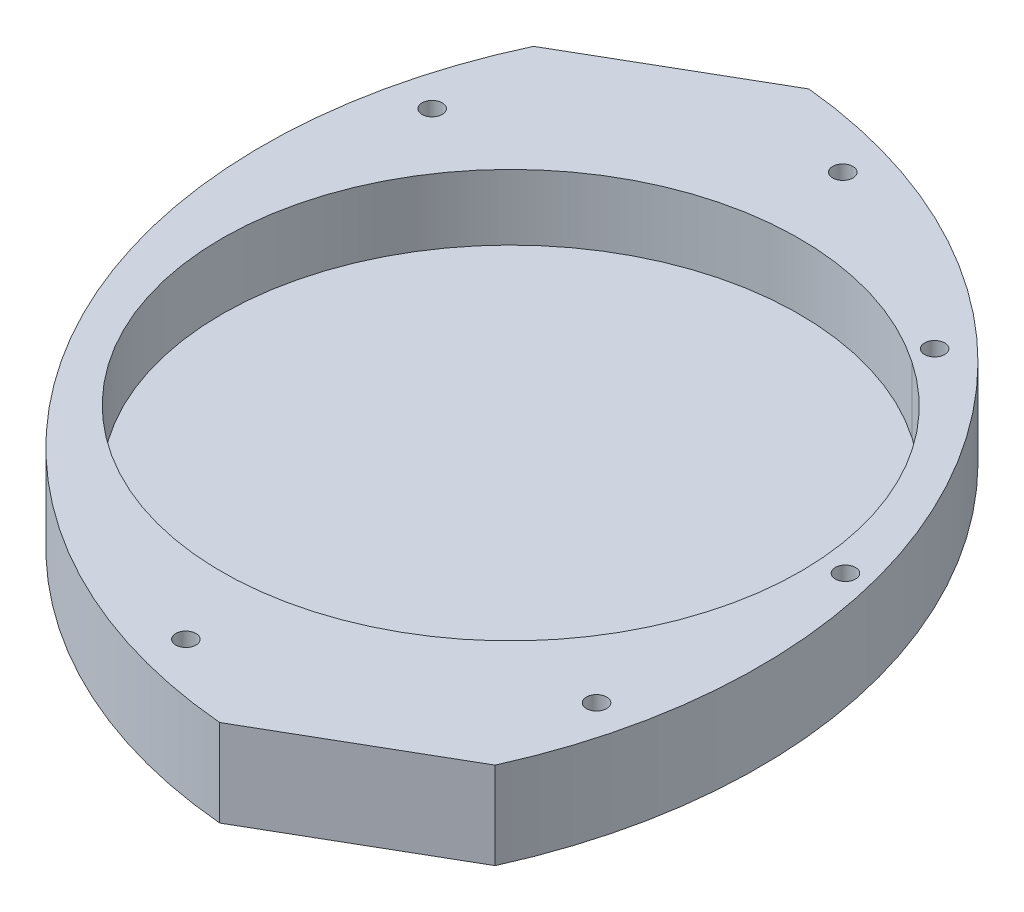
ISO-10303-21;
HEADER;
FILE_DESCRIPTION(('STEP AP214'),'2;1');
FILE_NAME('part.step','',(''),(''),'','','');
FILE_SCHEMA(('AUTOMOTIVE_DESIGN { 1 0 10303 214 1 1 1 1 }'));
ENDSEC;
DATA;
#1=APPLICATION_CONTEXT('core data for automotive mechanical design processes');
#2=APPLICATION_PROTOCOL_DEFINITION('international standard','automotive_design',2000,#1);
#3=PRODUCT_CONTEXT('',#1,'mechanical');
#4=PRODUCT('Part','Part','',(#3));
#5=PRODUCT_RELATED_PRODUCT_CATEGORY('part','',(#4));
#6=PRODUCT_DEFINITION_FORMATION('','',#4);
#7=PRODUCT_DEFINITION_CONTEXT('part definition',#1,'design');
#8=PRODUCT_DEFINITION('design','',#6,#7);
#9=PRODUCT_DEFINITION_SHAPE('','',#8);
#10=(LENGTH_UNIT() NAMED_UNIT(*) SI_UNIT(.MILLI.,.METRE.));
#11=(NAMED_UNIT(*) PLANE_ANGLE_UNIT() SI_UNIT($,.RADIAN.));
#12=(NAMED_UNIT(*) SI_UNIT($,.STERADIAN.) SOLID_ANGLE_UNIT());
#13=UNCERTAINTY_MEASURE_WITH_UNIT(LENGTH_MEASURE(1.E-05),#10,'distance_accuracy_value','');
#14=(GEOMETRIC_REPRESENTATION_CONTEXT(3) GLOBAL_UNCERTAINTY_ASSIGNED_CONTEXT((#13)) GLOBAL_UNIT_ASSIGNED_CONTEXT((#10,
#11,#12)) REPRESENTATION_CONTEXT('',''));
#15=CARTESIAN_POINT('',(0.,0.,0.));
#16=DIRECTION('',(0.,0.,1.));
#17=DIRECTION('',(1.,0.,0.));
#18=AXIS2_PLACEMENT_3D('',#15,#16,#17);
#19=CARTESIAN_POINT('',(213.514068784068,-90.805,-300.226275152134));
#20=DIRECTION('',(0.,1.,0.));
#21=DIRECTION('',(0.,0.,1.));
#22=AXIS2_PLACEMENT_3D('',#19,#20,#21);
#23=PLANE('',#22);
#24=CARTESIAN_POINT('',(-0.739793922050286,-90.805,0.263949779186919));
#25=DIRECTION('',(0.,1.,0.));
#26=DIRECTION('',(0.,0.,1.));
#27=AXIS2_PLACEMENT_3D('',#24,#25,#26);
#28=CIRCLE('',#27,80.01);
#29=CARTESIAN_POINT('',(44.5474079325533,-90.805,-65.6956548904925));
#30=VERTEX_POINT('',#29);
#31=CARTESIAN_POINT('',(76.0717263329417,-90.805,22.6601649977671));
#32=VERTEX_POINT('',#31);
#33=EDGE_CURVE('E104',#30,#32,#28,.T.);
#34=ORIENTED_EDGE('',*,*,#33,.F.);
#35=CARTESIAN_POINT('',(0.,-90.805,0.));
#36=DIRECTION('',(0.,1.,0.));
#37=DIRECTION('',(0.,0.,1.));
#38=AXIS2_PLACEMENT_3D('',#35,#36,#37);
#39=CIRCLE('',#38,79.375);
#40=EDGE_CURVE('E49',#32,#30,#39,.T.);
#41=ORIENTED_EDGE('',*,*,#40,.F.);
#42=EDGE_LOOP('',(#34,#41));
#43=FACE_BOUND('',#42,.T.);
#44=CARTESIAN_POINT('',(-82.7515968236829,-90.805,-60.0301730109568));
#45=DIRECTION('',(0.,1.,0.));
#46=DIRECTION('',(0.,0.,1.));
#47=AXIS2_PLACEMENT_3D('',#44,#45,#46);
#48=CIRCLE('',#47,2.79999999999999);
#49=CARTESIAN_POINT('',(-82.7515968236829,-90.805,-57.2301730109568));
#50=VERTEX_POINT('',#49);
#51=EDGE_CURVE('E127',#50,#50,#48,.T.);
#52=ORIENTED_EDGE('',*,*,#51,.F.);
#53=EDGE_LOOP('',(#52));
#54=FACE_BOUND('',#53,.T.);
#55=CARTESIAN_POINT('',(86.0110313328311,-90.805,-5.7939028008508));
#56=DIRECTION('',(0.,1.,0.));
#57=DIRECTION('',(0.,0.,1.));
#58=AXIS2_PLACEMENT_3D('',#55,#56,#57);
#59=CIRCLE('',#58,2.79400000000001);
#60=CARTESIAN_POINT('',(86.0110313328311,-90.805,-2.99990280085079));
#61=VERTEX_POINT('',#60);
#62=EDGE_CURVE('E116',#61,#61,#59,.T.);
#63=ORIENTED_EDGE('',*,*,#62,.F.);
#64=EDGE_LOOP('',(#63));
#65=FACE_BOUND('',#64,.T.);
#66=CARTESIAN_POINT('',(-10.6118564092235,-90.805,-101.680071558516));
#67=DIRECTION('',(0.,1.,0.));
#68=DIRECTION('',(0.,0.,1.));
#69=AXIS2_PLACEMENT_3D('',#66,#67,#68);
#70=CIRCLE('',#69,2.8);
#71=CARTESIAN_POINT('',(-10.6118564092235,-90.805,-98.8800715585156));
#72=VERTEX_POINT('',#71);
#73=EDGE_CURVE('E130',#72,#72,#70,.T.);
#74=ORIENTED_EDGE('',*,*,#73,.F.);
#75=EDGE_LOOP('',(#74));
#76=FACE_BOUND('',#75,.T.);
#77=CARTESIAN_POINT('',(82.6102870767567,-90.805,59.7854173496764));
#78=DIRECTION('',(0.,1.,0.));
#79=DIRECTION('',(0.,0.,1.));
#80=AXIS2_PLACEMENT_3D('',#77,#78,#79);
#81=CIRCLE('',#80,2.79999999999999);
#82=CARTESIAN_POINT('',(82.6102870767567,-90.805,62.5854173496764));
#83=VERTEX_POINT('',#82);
#84=EDGE_CURVE('E151',#83,#83,#81,.T.);
#85=ORIENTED_EDGE('',*,*,#84,.F.);
#86=EDGE_LOOP('',(#85));
#87=FACE_BOUND('',#86,.T.);
#88=CARTESIAN_POINT('',(10.4705466622961,-90.805,101.435315897235));
#89=DIRECTION('',(0.,1.,0.));
#90=DIRECTION('',(0.,0.,1.));
#91=AXIS2_PLACEMENT_3D('',#88,#89,#90);
#92=CIRCLE('',#91,2.8);
#93=CARTESIAN_POINT('',(10.4705466622961,-90.805,104.235315897235));
#94=VERTEX_POINT('',#93);
#95=EDGE_CURVE('E134',#94,#94,#92,.T.);
#96=ORIENTED_EDGE('',*,*,#95,.F.);
#97=EDGE_LOOP('',(#96));
#98=FACE_BOUND('',#97,.T.);
#99=CARTESIAN_POINT('',(44.4770863989794,-90.805,-72.035469587526));
#100=DIRECTION('',(0.,1.,0.));
#101=DIRECTION('',(0.,0.,1.));
#102=AXIS2_PLACEMENT_3D('',#99,#100,#101);
#103=CIRCLE('',#102,2.794);
#104=CARTESIAN_POINT('',(44.4770863989794,-90.805,-69.241469587526));
#105=VERTEX_POINT('',#104);
#106=EDGE_CURVE('E141',#105,#105,#103,.T.);
#107=ORIENTED_EDGE('',*,*,#106,.F.);
#108=EDGE_LOOP('',(#107));
#109=FACE_BOUND('',#108,.T.);
#110=DIRECTION('',(-0.866025403784438,0.,0.5));
#111=VECTOR('',#110,1.);
#112=CARTESIAN_POINT('',(62.7619820969,-90.805,-173.563398985594));
#113=LINE('',#112,#111);
#114=CARTESIAN_POINT('',(-35.2703372996776,-90.805,-116.964412992701));
#115=VERTEX_POINT('',#114);
#116=CARTESIAN_POINT('',(-83.6589843405733,-90.805,-89.0272145979133));
#117=VERTEX_POINT('',#116);
#118=EDGE_CURVE('E11',#115,#117,#113,.T.);
#119=ORIENTED_EDGE('',*,*,#118,.T.);
#120=CARTESIAN_POINT('',(47.450398117161,-90.805,-27.5586705669569));
#121=DIRECTION('',(0.,1.,0.));
#122=DIRECTION('',(0.,0.,1.));
#123=AXIS2_PLACEMENT_3D('',#120,#121,#122);
#124=CIRCLE('',#123,144.803494687576);
#125=CARTESIAN_POINT('',(35.129027552749,-90.805,116.719657331412));
#126=VERTEX_POINT('',#125);
#127=EDGE_CURVE('E126',#126,#117,#124,.F.);
#128=ORIENTED_EDGE('',*,*,#127,.F.);
#129=DIRECTION('',(-0.866025403784434,0.,0.500000000000008));
#130=VECTOR('',#129,1.);
#131=CARTESIAN_POINT('',(181.549993990223,-90.805,32.1834729437347));
#132=LINE('',#131,#130);
#133=CARTESIAN_POINT('',(83.5176745936469,-90.805,88.7824589366323));
#134=VERTEX_POINT('',#133);
#135=EDGE_CURVE('E69',#134,#126,#132,.T.);
#136=ORIENTED_EDGE('',*,*,#135,.F.);
#137=CARTESIAN_POINT('',(-49.7044286073696,-90.805,28.5336947955226));
#138=DIRECTION('',(0.,1.,0.));
#139=DIRECTION('',(0.,0.,1.));
#140=AXIS2_PLACEMENT_3D('',#137,#138,#139);
#141=CIRCLE('',#140,146.212319459861);
#142=EDGE_CURVE('E157',#115,#134,#141,.F.);
#143=ORIENTED_EDGE('',*,*,#142,.F.);
#144=EDGE_LOOP('',(#119,#128,#136,#143));
#145=FACE_BOUND('',#144,.T.);
#146=ADVANCED_FACE('F45',(#43,#54,#65,#76,#87,#98,#109,#145),#23,.T.);
#147=CARTESIAN_POINT('',(83.5176745936469,-145.923,88.7824589366323));
#148=DIRECTION('',(-0.500000000000006,0.,-0.866025403784435));
#149=DIRECTION('',(-0.866025403784435,0.,0.500000000000006));
#150=AXIS2_PLACEMENT_3D('',#147,#148,#149);
#151=PLANE('',#150);
#152=DIRECTION('',(0.,1.,0.));
#153=VECTOR('',#152,1.);
#154=CARTESIAN_POINT('',(35.1290275527505,-145.923,116.719657331416));
#155=LINE('',#154,#153);
#156=CARTESIAN_POINT('',(35.1290275527539,-114.935,116.719657331372));
#157=VERTEX_POINT('',#156);
#158=EDGE_CURVE('E166',#157,#126,#155,.T.);
#159=ORIENTED_EDGE('',*,*,#158,.F.);
#160=DIRECTION('',(-0.866025403784543,0.,0.499999999999819));
#161=VECTOR('',#160,1.);
#162=CARTESIAN_POINT('',(83.5176745936196,-114.935,88.7824589366199));
#163=LINE('',#162,#161);
#164=CARTESIAN_POINT('',(83.51767459363,-114.935,88.7824589366247));
#165=VERTEX_POINT('',#164);
#166=EDGE_CURVE('E113',#165,#157,#163,.T.);
#167=ORIENTED_EDGE('',*,*,#166,.F.);
#168=DIRECTION('',(0.,1.,0.));
#169=VECTOR('',#168,1.);
#170=CARTESIAN_POINT('',(83.5176745936469,-145.923,88.7824589366323));
#171=LINE('',#170,#169);
#172=EDGE_CURVE('E163',#165,#134,#171,.T.);
#173=ORIENTED_EDGE('',*,*,#172,.T.);
#174=ORIENTED_EDGE('',*,*,#135,.T.);
#175=EDGE_LOOP('',(#159,#167,#173,#174));
#176=FACE_BOUND('',#175,.T.);
#177=ADVANCED_FACE('F177',(#176),#151,.F.);
#178=CARTESIAN_POINT('',(-83.6589843405727,-145.923,-89.0272145979136));
#179=DIRECTION('',(0.500000000000001,0.,0.866025403784438));
#180=DIRECTION('',(0.866025403784438,0.,-0.500000000000001));
#181=AXIS2_PLACEMENT_3D('',#178,#179,#180);
#182=PLANE('',#181);
#183=DIRECTION('',(0.,1.,0.));
#184=VECTOR('',#183,1.);
#185=CARTESIAN_POINT('',(-35.2703372996761,-145.923,-116.964412992697));
#186=LINE('',#185,#184);
#187=CARTESIAN_POINT('',(-35.2703372996762,-114.935,-116.964412992697));
#188=VERTEX_POINT('',#187);
#189=EDGE_CURVE('E159',#188,#115,#186,.T.);
#190=ORIENTED_EDGE('',*,*,#189,.F.);
#191=DIRECTION('',(0.866025403784764,0.,-0.499999999999436));
#192=VECTOR('',#191,1.);
#193=CARTESIAN_POINT('',(-83.6589843405699,-114.935,-89.0272145979574));
#194=LINE('',#193,#192);
#195=CARTESIAN_POINT('',(-83.6589843405699,-114.935,-89.0272145979574));
#196=VERTEX_POINT('',#195);
#197=EDGE_CURVE('E187',#196,#188,#194,.T.);
#198=ORIENTED_EDGE('',*,*,#197,.F.);
#199=DIRECTION('',(0.,1.,0.));
#200=VECTOR('',#199,1.);
#201=CARTESIAN_POINT('',(-83.6589843405727,-145.923,-89.0272145979136));
#202=LINE('',#201,#200);
#203=EDGE_CURVE('E162',#196,#117,#202,.T.);
#204=ORIENTED_EDGE('',*,*,#203,.T.);
#205=ORIENTED_EDGE('',*,*,#118,.F.);
#206=EDGE_LOOP('',(#190,#198,#204,#205));
#207=FACE_BOUND('',#206,.T.);
#208=ADVANCED_FACE('F184',(#207),#182,.F.);
#209=CARTESIAN_POINT('',(0.,-106.934,0.));
#210=DIRECTION('',(0.,1.,0.));
#211=DIRECTION('',(0.,0.,1.));
#212=AXIS2_PLACEMENT_3D('',#209,#210,#211);
#213=CYLINDRICAL_SURFACE('',#212,79.375);
#214=CARTESIAN_POINT('',(0.,-108.966,0.));
#215=DIRECTION('',(0.,1.,0.));
#216=DIRECTION('',(0.,0.,1.));
#217=AXIS2_PLACEMENT_3D('',#214,#215,#216);
#218=CIRCLE('',#217,79.375);
#219=CARTESIAN_POINT('',(76.0717263329417,-108.966,22.6601649977671));
#220=VERTEX_POINT('',#219);
#221=CARTESIAN_POINT('',(44.5474079325533,-108.966,-65.6956548904925));
#222=VERTEX_POINT('',#221);
#223=EDGE_CURVE('E108',#220,#222,#218,.T.);
#224=ORIENTED_EDGE('',*,*,#223,.F.);
#225=DIRECTION('',(0.,1.,0.));
#226=VECTOR('',#225,1.);
#227=CARTESIAN_POINT('',(76.0717263329417,-99.8855,22.6601649977671));
#228=LINE('',#227,#226);
#229=EDGE_CURVE('E102',#220,#32,#228,.T.);
#230=ORIENTED_EDGE('',*,*,#229,.T.);
#231=ORIENTED_EDGE('',*,*,#40,.T.);
#232=DIRECTION('',(0.,1.,0.));
#233=VECTOR('',#232,1.);
#234=CARTESIAN_POINT('',(44.5474079325533,-99.8855,-65.6956548904925));
#235=LINE('',#234,#233);
#236=EDGE_CURVE('E99',#30,#222,#235,.F.);
#237=ORIENTED_EDGE('',*,*,#236,.T.);
#238=EDGE_LOOP('',(#224,#230,#231,#237));
#239=FACE_BOUND('',#238,.T.);
#240=ADVANCED_FACE('F47',(#239),#213,.F.);
#241=CARTESIAN_POINT('',(-49.7044286073696,212.823600707887,28.5336947955226));
#242=DIRECTION('',(0.,-1.,0.));
#243=DIRECTION('',(0.,0.,-1.));
#244=AXIS2_PLACEMENT_3D('',#241,#242,#243);
#245=CYLINDRICAL_SURFACE('',#244,146.212319459861);
#246=ORIENTED_EDGE('',*,*,#172,.F.);
#247=CARTESIAN_POINT('',(-49.7044286073696,-114.935,28.5336947955226));
#248=DIRECTION('',(0.,-1.,0.));
#249=DIRECTION('',(0.,0.,-1.));
#250=AXIS2_PLACEMENT_3D('',#247,#248,#249);
#251=CIRCLE('',#250,146.212319459845);
#252=EDGE_CURVE('E119',#188,#165,#251,.T.);
#253=ORIENTED_EDGE('',*,*,#252,.F.);
#254=ORIENTED_EDGE('',*,*,#189,.T.);
#255=ORIENTED_EDGE('',*,*,#142,.T.);
#256=EDGE_LOOP('',(#246,#253,#254,#255));
#257=FACE_BOUND('',#256,.T.);
#258=ADVANCED_FACE('F181',(#257),#245,.T.);
#259=CARTESIAN_POINT('',(47.450398117161,212.823600707887,-27.5586705669569));
#260=DIRECTION('',(0.,-1.,0.));
#261=DIRECTION('',(0.,0.,-1.));
#262=AXIS2_PLACEMENT_3D('',#259,#260,#261);
#263=CYLINDRICAL_SURFACE('',#262,144.803494687576);
#264=ORIENTED_EDGE('',*,*,#158,.T.);
#265=ORIENTED_EDGE('',*,*,#127,.T.);
#266=ORIENTED_EDGE('',*,*,#203,.F.);
#267=CARTESIAN_POINT('',(47.450398117161,-114.935,-27.5586705669569));
#268=DIRECTION('',(0.,-1.,0.));
#269=DIRECTION('',(0.,0.,-1.));
#270=AXIS2_PLACEMENT_3D('',#267,#268,#269);
#271=CIRCLE('',#270,144.803494687562);
#272=EDGE_CURVE('E174',#157,#196,#271,.T.);
#273=ORIENTED_EDGE('',*,*,#272,.F.);
#274=EDGE_LOOP('',(#264,#265,#266,#273));
#275=FACE_BOUND('',#274,.T.);
#276=ADVANCED_FACE('F172',(#275),#263,.T.);
#277=CARTESIAN_POINT('',(44.4770863989794,-99.905,-72.035469587526));
#278=DIRECTION('',(0.,1.,0.));
#279=DIRECTION('',(0.,0.,1.));
#280=AXIS2_PLACEMENT_3D('',#277,#278,#279);
#281=CYLINDRICAL_SURFACE('',#280,2.794);
#282=CARTESIAN_POINT('',(44.4770863989794,-99.905,-72.035469587526));
#283=DIRECTION('',(0.,1.,0.));
#284=DIRECTION('',(0.,0.,1.));
#285=AXIS2_PLACEMENT_3D('',#282,#283,#284);
#286=CIRCLE('',#285,2.794);
#287=CARTESIAN_POINT('',(44.4770863989794,-99.905,-69.241469587526));
#288=VERTEX_POINT('',#287);
#289=EDGE_CURVE('E132',#288,#288,#286,.T.);
#290=ORIENTED_EDGE('',*,*,#289,.F.);
#291=EDGE_LOOP('',(#290));
#292=FACE_BOUND('',#291,.T.);
#293=ORIENTED_EDGE('',*,*,#106,.T.);
#294=EDGE_LOOP('',(#293));
#295=FACE_BOUND('',#294,.T.);
#296=ADVANCED_FACE('F210',(#292,#295),#281,.F.);
#297=CARTESIAN_POINT('',(44.4770863989794,-99.905,-72.035469587526));
#298=DIRECTION('',(0.,1.,0.));
#299=DIRECTION('',(0.,0.,1.));
#300=AXIS2_PLACEMENT_3D('',#297,#298,#299);
#301=PLANE('',#300);
#302=ORIENTED_EDGE('',*,*,#289,.T.);
#303=EDGE_LOOP('',(#302));
#304=FACE_BOUND('',#303,.T.);
#305=ADVANCED_FACE('F212',(#304),#301,.T.);
#306=CARTESIAN_POINT('',(10.4705466622961,-99.905,101.435315897235));
#307=DIRECTION('',(0.,1.,0.));
#308=DIRECTION('',(0.,0.,1.));
#309=AXIS2_PLACEMENT_3D('',#306,#307,#308);
#310=CYLINDRICAL_SURFACE('',#309,2.8);
#311=CARTESIAN_POINT('',(10.4705466622961,-99.905,101.435315897235));
#312=DIRECTION('',(0.,1.,0.));
#313=DIRECTION('',(0.,0.,1.));
#314=AXIS2_PLACEMENT_3D('',#311,#312,#313);
#315=CIRCLE('',#314,2.8);
#316=CARTESIAN_POINT('',(10.4705466622961,-99.905,104.235315897235));
#317=VERTEX_POINT('',#316);
#318=EDGE_CURVE('E138',#317,#317,#315,.T.);
#319=ORIENTED_EDGE('',*,*,#318,.F.);
#320=EDGE_LOOP('',(#319));
#321=FACE_BOUND('',#320,.T.);
#322=ORIENTED_EDGE('',*,*,#95,.T.);
#323=EDGE_LOOP('',(#322));
#324=FACE_BOUND('',#323,.T.);
#325=ADVANCED_FACE('F218',(#321,#324),#310,.F.);
#326=CARTESIAN_POINT('',(10.4705466622961,-99.905,101.435315897235));
#327=DIRECTION('',(0.,1.,0.));
#328=DIRECTION('',(0.,0.,1.));
#329=AXIS2_PLACEMENT_3D('',#326,#327,#328);
#330=PLANE('',#329);
#331=ORIENTED_EDGE('',*,*,#318,.T.);
#332=EDGE_LOOP('',(#331));
#333=FACE_BOUND('',#332,.T.);
#334=ADVANCED_FACE('F225',(#333),#330,.T.);
#335=CARTESIAN_POINT('',(82.6102870767567,-99.905,59.7854173496764));
#336=DIRECTION('',(0.,1.,0.));
#337=DIRECTION('',(0.,0.,1.));
#338=AXIS2_PLACEMENT_3D('',#335,#336,#337);
#339=CYLINDRICAL_SURFACE('',#338,2.79999999999999);
#340=CARTESIAN_POINT('',(82.6102870767567,-99.905,59.7854173496764));
#341=DIRECTION('',(0.,1.,0.));
#342=DIRECTION('',(0.,0.,1.));
#343=AXIS2_PLACEMENT_3D('',#340,#341,#342);
#344=CIRCLE('',#343,2.79999999999999);
#345=CARTESIAN_POINT('',(82.6102870767567,-99.905,62.5854173496764));
#346=VERTEX_POINT('',#345);
#347=EDGE_CURVE('E137',#346,#346,#344,.T.);
#348=ORIENTED_EDGE('',*,*,#347,.F.);
#349=EDGE_LOOP('',(#348));
#350=FACE_BOUND('',#349,.T.);
#351=ORIENTED_EDGE('',*,*,#84,.T.);
#352=EDGE_LOOP('',(#351));
#353=FACE_BOUND('',#352,.T.);
#354=ADVANCED_FACE('F238',(#350,#353),#339,.F.);
#355=CARTESIAN_POINT('',(82.6102870767567,-99.905,59.7854173496764));
#356=DIRECTION('',(0.,1.,0.));
#357=DIRECTION('',(0.,0.,1.));
#358=AXIS2_PLACEMENT_3D('',#355,#356,#357);
#359=PLANE('',#358);
#360=ORIENTED_EDGE('',*,*,#347,.T.);
#361=EDGE_LOOP('',(#360));
#362=FACE_BOUND('',#361,.T.);
#363=ADVANCED_FACE('F232',(#362),#359,.T.);
#364=CARTESIAN_POINT('',(-10.6118564092235,-99.905,-101.680071558516));
#365=DIRECTION('',(0.,1.,0.));
#366=DIRECTION('',(0.,0.,1.));
#367=AXIS2_PLACEMENT_3D('',#364,#365,#366);
#368=CYLINDRICAL_SURFACE('',#367,2.8);
#369=CARTESIAN_POINT('',(-10.6118564092235,-99.905,-101.680071558516));
#370=DIRECTION('',(0.,1.,0.));
#371=DIRECTION('',(0.,0.,1.));
#372=AXIS2_PLACEMENT_3D('',#369,#370,#371);
#373=CIRCLE('',#372,2.8);
#374=CARTESIAN_POINT('',(-10.6118564092235,-99.905,-98.8800715585156));
#375=VERTEX_POINT('',#374);
#376=EDGE_CURVE('E148',#375,#375,#373,.T.);
#377=ORIENTED_EDGE('',*,*,#376,.F.);
#378=EDGE_LOOP('',(#377));
#379=FACE_BOUND('',#378,.T.);
#380=ORIENTED_EDGE('',*,*,#73,.T.);
#381=EDGE_LOOP('',(#380));
#382=FACE_BOUND('',#381,.T.);
#383=ADVANCED_FACE('F228',(#379,#382),#368,.F.);
#384=CARTESIAN_POINT('',(-10.6118564092235,-99.905,-101.680071558516));
#385=DIRECTION('',(0.,1.,0.));
#386=DIRECTION('',(0.,0.,1.));
#387=AXIS2_PLACEMENT_3D('',#384,#385,#386);
#388=PLANE('',#387);
#389=ORIENTED_EDGE('',*,*,#376,.T.);
#390=EDGE_LOOP('',(#389));
#391=FACE_BOUND('',#390,.T.);
#392=ADVANCED_FACE('F231',(#391),#388,.T.);
#393=CARTESIAN_POINT('',(86.0110313328311,-99.905,-5.7939028008508));
#394=DIRECTION('',(0.,1.,0.));
#395=DIRECTION('',(0.,0.,1.));
#396=AXIS2_PLACEMENT_3D('',#393,#394,#395);
#397=CYLINDRICAL_SURFACE('',#396,2.79400000000001);
#398=CARTESIAN_POINT('',(86.0110313328311,-99.905,-5.7939028008508));
#399=DIRECTION('',(0.,1.,0.));
#400=DIRECTION('',(0.,0.,1.));
#401=AXIS2_PLACEMENT_3D('',#398,#399,#400);
#402=CIRCLE('',#401,2.79400000000001);
#403=CARTESIAN_POINT('',(86.0110313328311,-99.905,-2.99990280085079));
#404=VERTEX_POINT('',#403);
#405=EDGE_CURVE('E112',#404,#404,#402,.T.);
#406=ORIENTED_EDGE('',*,*,#405,.F.);
#407=EDGE_LOOP('',(#406));
#408=FACE_BOUND('',#407,.T.);
#409=ORIENTED_EDGE('',*,*,#62,.T.);
#410=EDGE_LOOP('',(#409));
#411=FACE_BOUND('',#410,.T.);
#412=ADVANCED_FACE('F236',(#408,#411),#397,.F.);
#413=CARTESIAN_POINT('',(86.0110313328311,-99.905,-5.7939028008508));
#414=DIRECTION('',(0.,1.,0.));
#415=DIRECTION('',(0.,0.,1.));
#416=AXIS2_PLACEMENT_3D('',#413,#414,#415);
#417=PLANE('',#416);
#418=ORIENTED_EDGE('',*,*,#405,.T.);
#419=EDGE_LOOP('',(#418));
#420=FACE_BOUND('',#419,.T.);
#421=ADVANCED_FACE('F323',(#420),#417,.T.);
#422=CARTESIAN_POINT('',(-82.7515968236829,-99.905,-60.0301730109568));
#423=DIRECTION('',(0.,1.,0.));
#424=DIRECTION('',(0.,0.,1.));
#425=AXIS2_PLACEMENT_3D('',#422,#423,#424);
#426=CYLINDRICAL_SURFACE('',#425,2.79999999999999);
#427=CARTESIAN_POINT('',(-82.7515968236829,-99.905,-60.0301730109568));
#428=DIRECTION('',(0.,1.,0.));
#429=DIRECTION('',(0.,0.,1.));
#430=AXIS2_PLACEMENT_3D('',#427,#428,#429);
#431=CIRCLE('',#430,2.79999999999999);
#432=CARTESIAN_POINT('',(-82.7515968236829,-99.905,-57.2301730109568));
#433=VERTEX_POINT('',#432);
#434=EDGE_CURVE('E123',#433,#433,#431,.T.);
#435=ORIENTED_EDGE('',*,*,#434,.F.);
#436=EDGE_LOOP('',(#435));
#437=FACE_BOUND('',#436,.T.);
#438=ORIENTED_EDGE('',*,*,#51,.T.);
#439=EDGE_LOOP('',(#438));
#440=FACE_BOUND('',#439,.T.);
#441=ADVANCED_FACE('F315',(#437,#440),#426,.F.);
#442=CARTESIAN_POINT('',(-82.7515968236829,-99.905,-60.0301730109568));
#443=DIRECTION('',(0.,1.,0.));
#444=DIRECTION('',(0.,0.,1.));
#445=AXIS2_PLACEMENT_3D('',#442,#443,#444);
#446=PLANE('',#445);
#447=ORIENTED_EDGE('',*,*,#434,.T.);
#448=EDGE_LOOP('',(#447));
#449=FACE_BOUND('',#448,.T.);
#450=ADVANCED_FACE('F257',(#449),#446,.T.);
#451=CARTESIAN_POINT('',(0.,-108.966,0.));
#452=DIRECTION('',(0.,1.,0.));
#453=DIRECTION('',(0.,0.,1.));
#454=AXIS2_PLACEMENT_3D('',#451,#452,#453);
#455=PLANE('',#454);
#456=ORIENTED_EDGE('',*,*,#223,.T.);
#457=CARTESIAN_POINT('',(-0.739793922050286,-108.966,0.263949779186919));
#458=DIRECTION('',(0.,1.,0.));
#459=DIRECTION('',(0.,0.,1.));
#460=AXIS2_PLACEMENT_3D('',#457,#458,#459);
#461=CIRCLE('',#460,80.01);
#462=EDGE_CURVE('E60',#220,#222,#461,.F.);
#463=ORIENTED_EDGE('',*,*,#462,.F.);
#464=EDGE_LOOP('',(#456,#463));
#465=FACE_BOUND('',#464,.T.);
#466=ADVANCED_FACE('F111',(#465),#455,.T.);
#467=CARTESIAN_POINT('',(47.450398117161,-114.935,-27.5586705669569));
#468=DIRECTION('',(0.,-1.,0.));
#469=DIRECTION('',(0.,0.,-1.));
#470=AXIS2_PLACEMENT_3D('',#467,#468,#469);
#471=PLANE('',#470);
#472=ORIENTED_EDGE('',*,*,#272,.T.);
#473=ORIENTED_EDGE('',*,*,#197,.T.);
#474=ORIENTED_EDGE('',*,*,#252,.T.);
#475=ORIENTED_EDGE('',*,*,#166,.T.);
#476=EDGE_LOOP('',(#472,#473,#474,#475));
#477=FACE_BOUND('',#476,.T.);
#478=ADVANCED_FACE('F190',(#477),#471,.T.);
#479=CARTESIAN_POINT('',(-0.739793922050286,-335.268454250943,0.263949779186919));
#480=DIRECTION('',(0.,1.,0.));
#481=DIRECTION('',(0.,0.,1.));
#482=AXIS2_PLACEMENT_3D('',#479,#480,#481);
#483=CYLINDRICAL_SURFACE('',#482,80.01);
#484=ORIENTED_EDGE('',*,*,#462,.T.);
#485=ORIENTED_EDGE('',*,*,#236,.F.);
#486=ORIENTED_EDGE('',*,*,#33,.T.);
#487=ORIENTED_EDGE('',*,*,#229,.F.);
#488=EDGE_LOOP('',(#484,#485,#486,#487));
#489=FACE_BOUND('',#488,.T.);
#490=ADVANCED_FACE('F98',(#489),#483,.F.);
#491=CLOSED_SHELL('',(#146,#177,#208,#240,#258,#276,#296,#305,#325,#334,#354,#363,#383,#392,
#412,#421,#441,#450,#466,#478,#490));
#492=MANIFOLD_SOLID_BREP('B2',#491);
#493=ADVANCED_BREP_SHAPE_REPRESENTATION('',(#18,#492),#14);
#494=SHAPE_DEFINITION_REPRESENTATION(#9,#493);
ENDSEC;
END-ISO-10303-21;
